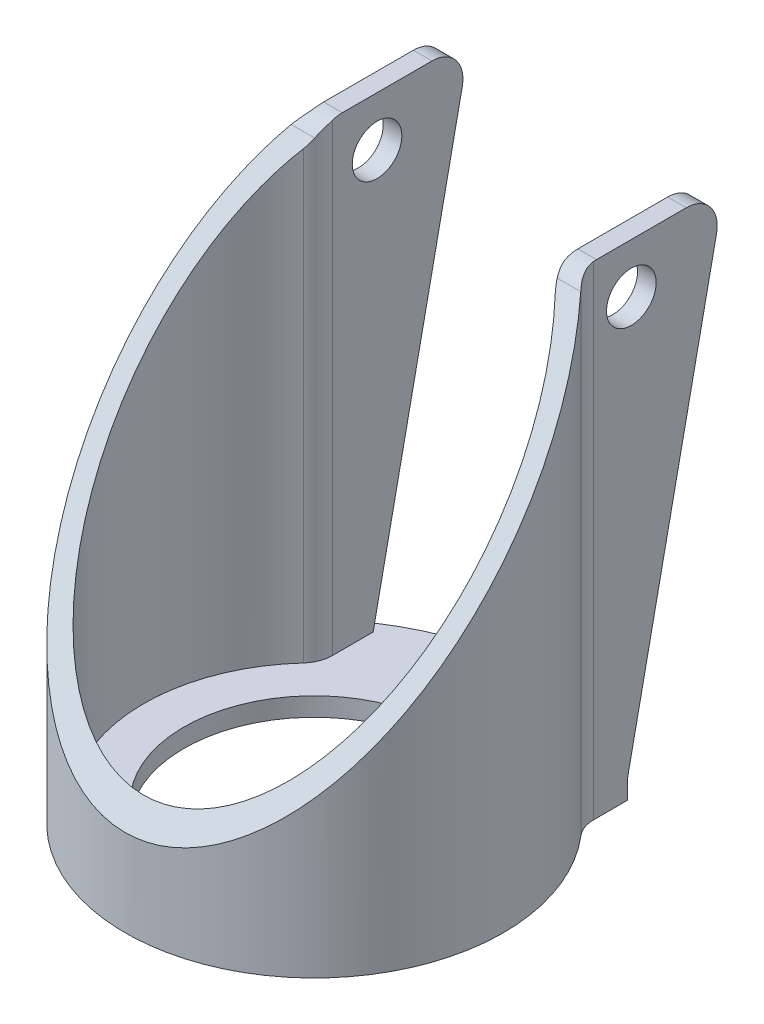
ISO-10303-21;
HEADER;
FILE_DESCRIPTION(('STEP AP214'),'2;1');
FILE_NAME('part.step','',(''),(''),'','','');
FILE_SCHEMA(('AUTOMOTIVE_DESIGN { 1 0 10303 214 1 1 1 1 }'));
ENDSEC;
DATA;
#1=APPLICATION_CONTEXT('core data for automotive mechanical design processes');
#2=APPLICATION_PROTOCOL_DEFINITION('international standard','automotive_design',2000,#1);
#3=PRODUCT_CONTEXT('',#1,'mechanical');
#4=PRODUCT('Part','Part','',(#3));
#5=PRODUCT_RELATED_PRODUCT_CATEGORY('part','',(#4));
#6=PRODUCT_DEFINITION_FORMATION('','',#4);
#7=PRODUCT_DEFINITION_CONTEXT('part definition',#1,'design');
#8=PRODUCT_DEFINITION('design','',#6,#7);
#9=PRODUCT_DEFINITION_SHAPE('','',#8);
#10=(LENGTH_UNIT() NAMED_UNIT(*) SI_UNIT(.MILLI.,.METRE.));
#11=(NAMED_UNIT(*) PLANE_ANGLE_UNIT() SI_UNIT($,.RADIAN.));
#12=(NAMED_UNIT(*) SI_UNIT($,.STERADIAN.) SOLID_ANGLE_UNIT());
#13=UNCERTAINTY_MEASURE_WITH_UNIT(LENGTH_MEASURE(1.E-05),#10,'distance_accuracy_value','');
#14=(GEOMETRIC_REPRESENTATION_CONTEXT(3) GLOBAL_UNCERTAINTY_ASSIGNED_CONTEXT((#13)) GLOBAL_UNIT_ASSIGNED_CONTEXT((#10,
#11,#12)) REPRESENTATION_CONTEXT('',''));
#15=CARTESIAN_POINT('',(0.,0.,0.));
#16=DIRECTION('',(0.,0.,1.));
#17=DIRECTION('',(1.,0.,0.));
#18=AXIS2_PLACEMENT_3D('',#15,#16,#17);
#19=CARTESIAN_POINT('',(0.,78.,0.));
#20=DIRECTION('',(0.,-1.,0.));
#21=DIRECTION('',(0.,0.,-1.));
#22=AXIS2_PLACEMENT_3D('',#19,#20,#21);
#23=PLANE('',#22);
#24=DIRECTION('',(0.,0.,1.));
#25=VECTOR('',#24,1.);
#26=CARTESIAN_POINT('',(-22.,78.,-21.1246301742776));
#27=LINE('',#26,#25);
#28=CARTESIAN_POINT('',(-22.,78.,-37.975286677213));
#29=VERTEX_POINT('',#28);
#30=CARTESIAN_POINT('',(-22.,78.,-23.5153561893177));
#31=VERTEX_POINT('',#30);
#32=EDGE_CURVE('E406',#29,#31,#27,.T.);
#33=ORIENTED_EDGE('',*,*,#32,.T.);
#34=DIRECTION('',(1.,0.,0.));
#35=VECTOR('',#34,1.);
#36=CARTESIAN_POINT('',(0.,78.,-23.5153561893177));
#37=LINE('',#36,#35);
#38=CARTESIAN_POINT('',(-19.,78.,-23.5153561893177));
#39=VERTEX_POINT('',#38);
#40=EDGE_CURVE('E441',#31,#39,#37,.T.);
#41=ORIENTED_EDGE('',*,*,#40,.T.);
#42=DIRECTION('',(0.,0.,-1.));
#43=VECTOR('',#42,1.);
#44=CARTESIAN_POINT('',(-19.,78.,-44.1246301742776));
#45=LINE('',#44,#43);
#46=CARTESIAN_POINT('',(-19.,78.,-37.975286677213));
#47=VERTEX_POINT('',#46);
#48=EDGE_CURVE('E367',#39,#47,#45,.T.);
#49=ORIENTED_EDGE('',*,*,#48,.T.);
#50=DIRECTION('',(-1.,0.,0.));
#51=VECTOR('',#50,1.);
#52=CARTESIAN_POINT('',(0.,78.,-37.975286677213));
#53=LINE('',#52,#51);
#54=EDGE_CURVE('E489',#47,#29,#53,.T.);
#55=ORIENTED_EDGE('',*,*,#54,.T.);
#56=EDGE_LOOP('',(#33,#41,#49,#55));
#57=FACE_BOUND('',#56,.T.);
#58=ADVANCED_FACE('F54',(#57),#23,.F.);
#59=CARTESIAN_POINT('',(0.,3.,0.));
#60=DIRECTION('',(0.,1.,0.));
#61=DIRECTION('',(0.,0.,1.));
#62=AXIS2_PLACEMENT_3D('',#59,#60,#61);
#63=PLANE('',#62);
#64=CARTESIAN_POINT('',(0.,3.,0.));
#65=DIRECTION('',(0.,1.,0.));
#66=DIRECTION('',(0.,0.,1.));
#67=AXIS2_PLACEMENT_3D('',#64,#65,#66);
#68=CIRCLE('',#67,21.);
#69=CARTESIAN_POINT('',(0.,3.,21.));
#70=VERTEX_POINT('',#69);
#71=EDGE_CURVE('E400',#70,#70,#68,.T.);
#72=ORIENTED_EDGE('',*,*,#71,.F.);
#73=EDGE_LOOP('',(#72));
#74=FACE_BOUND('',#73,.T.);
#75=CARTESIAN_POINT('',(0.,3.,0.));
#76=DIRECTION('',(0.,1.,0.));
#77=DIRECTION('',(0.,0.,1.));
#78=AXIS2_PLACEMENT_3D('',#75,#76,#77);
#79=CIRCLE('',#78,36.);
#80=CARTESIAN_POINT('',(22.,3.,-28.49561369755));
#81=VERTEX_POINT('',#80);
#82=CARTESIAN_POINT('',(-22.,3.,-28.49561369755));
#83=VERTEX_POINT('',#82);
#84=EDGE_CURVE('E502',#81,#83,#79,.T.);
#85=ORIENTED_EDGE('',*,*,#84,.T.);
#86=DIRECTION('',(-1.,0.,0.));
#87=VECTOR('',#86,1.);
#88=CARTESIAN_POINT('',(-22.,3.,-28.49561369755));
#89=LINE('',#88,#87);
#90=CARTESIAN_POINT('',(-19.,3.,-28.49561369755));
#91=VERTEX_POINT('',#90);
#92=EDGE_CURVE('E227',#91,#83,#89,.T.);
#93=ORIENTED_EDGE('',*,*,#92,.F.);
#94=DIRECTION('',(0.,0.,-1.));
#95=VECTOR('',#94,1.);
#96=CARTESIAN_POINT('',(-19.,3.,-19.880895352071));
#97=LINE('',#96,#95);
#98=CARTESIAN_POINT('',(-19.,3.,-21.9146070008111));
#99=VERTEX_POINT('',#98);
#100=EDGE_CURVE('E218',#99,#91,#97,.T.);
#101=ORIENTED_EDGE('',*,*,#100,.F.);
#102=CARTESIAN_POINT('',(-24.,3.,-21.9146070008111));
#103=DIRECTION('',(0.,1.,0.));
#104=DIRECTION('',(0.,0.,1.));
#105=AXIS2_PLACEMENT_3D('',#102,#103,#104);
#106=CIRCLE('',#105,5.);
#107=CARTESIAN_POINT('',(-20.3076923076923,3.,-18.5431290006863));
#108=VERTEX_POINT('',#107);
#109=EDGE_CURVE('E251',#99,#108,#106,.F.);
#110=ORIENTED_EDGE('',*,*,#109,.T.);
#111=CARTESIAN_POINT('',(0.,3.,0.));
#112=DIRECTION('',(0.,-1.,0.));
#113=DIRECTION('',(0.,0.,-1.));
#114=AXIS2_PLACEMENT_3D('',#111,#112,#113);
#115=CIRCLE('',#114,27.5);
#116=CARTESIAN_POINT('',(20.3076923076923,3.,-18.5431290006863));
#117=VERTEX_POINT('',#116);
#118=EDGE_CURVE('E215',#117,#108,#115,.T.);
#119=ORIENTED_EDGE('',*,*,#118,.F.);
#120=CARTESIAN_POINT('',(24.,3.,-21.9146070008111));
#121=DIRECTION('',(0.,1.,0.));
#122=DIRECTION('',(0.,0.,1.));
#123=AXIS2_PLACEMENT_3D('',#120,#121,#122);
#124=CIRCLE('',#123,5.);
#125=CARTESIAN_POINT('',(19.,3.,-21.9146070008111));
#126=VERTEX_POINT('',#125);
#127=EDGE_CURVE('E214',#117,#126,#124,.F.);
#128=ORIENTED_EDGE('',*,*,#127,.T.);
#129=DIRECTION('',(0.,0.,1.));
#130=VECTOR('',#129,1.);
#131=CARTESIAN_POINT('',(19.,3.,-19.880895352071));
#132=LINE('',#131,#130);
#133=CARTESIAN_POINT('',(19.,3.,-28.49561369755));
#134=VERTEX_POINT('',#133);
#135=EDGE_CURVE('E200',#134,#126,#132,.T.);
#136=ORIENTED_EDGE('',*,*,#135,.F.);
#137=DIRECTION('',(-1.,0.,0.));
#138=VECTOR('',#137,1.);
#139=CARTESIAN_POINT('',(22.,3.,-28.49561369755));
#140=LINE('',#139,#138);
#141=EDGE_CURVE('E188',#81,#134,#140,.T.);
#142=ORIENTED_EDGE('',*,*,#141,.F.);
#143=EDGE_LOOP('',(#85,#93,#101,#110,#119,#128,#136,#142));
#144=FACE_BOUND('',#143,.T.);
#145=ADVANCED_FACE('F211',(#74,#144),#63,.T.);
#146=CARTESIAN_POINT('',(0.,3.,0.));
#147=DIRECTION('',(0.,-1.,0.));
#148=DIRECTION('',(0.,0.,-1.));
#149=AXIS2_PLACEMENT_3D('',#146,#147,#148);
#150=CYLINDRICAL_SURFACE('',#149,30.5);
#151=CARTESIAN_POINT('',(0.,0.,0.));
#152=DIRECTION('',(0.,1.,0.));
#153=DIRECTION('',(0.,0.,1.));
#154=AXIS2_PLACEMENT_3D('',#151,#152,#153);
#155=CIRCLE('',#154,30.5);
#156=CARTESIAN_POINT('',(-23.1971830985916,0.,-19.8025426723544));
#157=VERTEX_POINT('',#156);
#158=CARTESIAN_POINT('',(23.1971830985915,0.,-19.8025426723544));
#159=VERTEX_POINT('',#158);
#160=EDGE_CURVE('E199',#157,#159,#155,.T.);
#161=ORIENTED_EDGE('',*,*,#160,.T.);
#162=DIRECTION('',(0.,-1.,0.));
#163=VECTOR('',#162,1.);
#164=CARTESIAN_POINT('',(23.1971830985915,3.,-19.8025426723544));
#165=LINE('',#164,#163);
#166=CARTESIAN_POINT('',(23.1971830985915,76.3488827671711,-19.8025426723544));
#167=VERTEX_POINT('',#166);
#168=EDGE_CURVE('E246',#159,#167,#165,.F.);
#169=ORIENTED_EDGE('',*,*,#168,.T.);
#170=CARTESIAN_POINT('',(22.,77.3914040033924,-21.1246301742776));
#171=CARTESIAN_POINT('',(22.1289321810784,77.3183150493568,-20.9903877406979));
#172=CARTESIAN_POINT('',(22.2546545072071,77.2376963424579,-20.8569621551417));
#173=CARTESIAN_POINT('',(22.4973369160986,77.0615056867437,-20.5949289066458));
#174=CARTESIAN_POINT('',(22.614367908363,76.9660805305629,-20.4662878701357));
#175=CARTESIAN_POINT('',(22.839823941531,76.7590012604669,-20.2143763734541));
#176=CARTESIAN_POINT('',(22.948245538373,76.6473407018836,-20.0911080713725));
#177=CARTESIAN_POINT('',(23.1560241114799,76.4064533393783,-19.8513045827247));
#178=CARTESIAN_POINT('',(23.2552858808033,76.2770706952375,-19.7348439213353));
#179=CARTESIAN_POINT('',(23.3487210351135,76.1391943188989,-19.6236394693861));
#180=B_SPLINE_CURVE_WITH_KNOTS('',3,(#170,#171,#172,#173,#174,#175,#176,#177,#178,#179),
.UNSPECIFIED.,.F.,.F.,(4,2,2,2,4),(0.,0.599925544756917,1.19424426644912,1.7887995512264,
2.38896610469934),.UNSPECIFIED.);
#181=CARTESIAN_POINT('',(23.3487210351134,76.1391943188987,-19.6236394693862));
#182=VERTEX_POINT('',#181);
#183=EDGE_CURVE('E275',#167,#182,#180,.T.);
#184=ORIENTED_EDGE('',*,*,#183,.T.);
#185=CARTESIAN_POINT('',(0.,51.8114088839052,0.));
#186=DIRECTION('',(0.,-0.627838863779736,-0.778343343986297));
#187=DIRECTION('',(0.,-0.778343343986297,0.627838863779736));
#188=AXIS2_PLACEMENT_3D('',#185,#186,#187);
#189=ELLIPSE('',#188,48.5793437768139,30.5);
#190=CARTESIAN_POINT('',(-23.3487210351134,76.1391943188987,-19.6236394693862));
#191=VERTEX_POINT('',#190);
#192=EDGE_CURVE('E555',#182,#191,#189,.T.);
#193=ORIENTED_EDGE('',*,*,#192,.T.);
#194=CARTESIAN_POINT('',(-23.3487210351134,76.1391943188987,-19.6236394693862));
#195=CARTESIAN_POINT('',(-23.2552858808033,76.2770706952374,-19.7348439213353));
#196=CARTESIAN_POINT('',(-23.15602411148,76.4064533393782,-19.8513045827247));
#197=CARTESIAN_POINT('',(-22.948245538373,76.6473407018835,-20.0911080713725));
#198=CARTESIAN_POINT('',(-22.8398239415311,76.7590012604669,-20.2143763734541));
#199=CARTESIAN_POINT('',(-22.6143679083631,76.9660805305629,-20.4662878701357));
#200=CARTESIAN_POINT('',(-22.4973369160986,77.0615056867437,-20.5949289066458));
#201=CARTESIAN_POINT('',(-22.2546545072072,77.2376963424579,-20.8569621551417));
#202=CARTESIAN_POINT('',(-22.1289321810784,77.3183150493568,-20.9903877406979));
#203=CARTESIAN_POINT('',(-22.,77.3914040033924,-21.1246301742776));
#204=B_SPLINE_CURVE_WITH_KNOTS('',3,(#194,#195,#196,#197,#198,#199,#200,#201,#202,#203),
.UNSPECIFIED.,.F.,.F.,(4,2,2,2,4),(0.,0.600166553472969,1.19472183825027,1.78904055994249,
2.38896610469943),.UNSPECIFIED.);
#205=CARTESIAN_POINT('',(-23.1971830985916,76.348882767171,-19.8025426723544));
#206=VERTEX_POINT('',#205);
#207=EDGE_CURVE('E282',#191,#206,#204,.T.);
#208=ORIENTED_EDGE('',*,*,#207,.T.);
#209=DIRECTION('',(0.,-1.,0.));
#210=VECTOR('',#209,1.);
#211=CARTESIAN_POINT('',(-23.1971830985916,3.,-19.8025426723544));
#212=LINE('',#211,#210);
#213=EDGE_CURVE('E243',#206,#157,#212,.T.);
#214=ORIENTED_EDGE('',*,*,#213,.T.);
#215=EDGE_LOOP('',(#161,#169,#184,#193,#208,#214));
#216=FACE_BOUND('',#215,.T.);
#217=ADVANCED_FACE('F289',(#216),#150,.T.);
#218=CARTESIAN_POINT('',(22.,3.,0.));
#219=DIRECTION('',(1.,0.,0.));
#220=DIRECTION('',(0.,0.,-1.));
#221=AXIS2_PLACEMENT_3D('',#218,#219,#220);
#222=PLANE('',#221);
#223=CARTESIAN_POINT('',(22.,70.,-29.1246301742776));
#224=DIRECTION('',(1.,0.,0.));
#225=DIRECTION('',(0.,0.,-1.));
#226=AXIS2_PLACEMENT_3D('',#223,#224,#225);
#227=CIRCLE('',#226,4.);
#228=CARTESIAN_POINT('',(22.,70.,-33.1246301742776));
#229=VERTEX_POINT('',#228);
#230=EDGE_CURVE('E556',#229,#229,#227,.T.);
#231=ORIENTED_EDGE('',*,*,#230,.F.);
#232=EDGE_LOOP('',(#231));
#233=FACE_BOUND('',#232,.T.);
#234=CARTESIAN_POINT('',(22.,73.,-23.5153561893177));
#235=DIRECTION('',(1.,0.,0.));
#236=DIRECTION('',(0.,0.,-1.));
#237=AXIS2_PLACEMENT_3D('',#234,#235,#236);
#238=CIRCLE('',#237,5.);
#239=CARTESIAN_POINT('',(22.,78.,-23.5153561893177));
#240=VERTEX_POINT('',#239);
#241=CARTESIAN_POINT('',(22.,77.9781906725213,-23.0488611432322));
#242=VERTEX_POINT('',#241);
#243=EDGE_CURVE('E353',#240,#242,#238,.T.);
#244=ORIENTED_EDGE('',*,*,#243,.T.);
#245=DIRECTION('',(0.,-1.,0.));
#246=VECTOR('',#245,1.);
#247=CARTESIAN_POINT('',(22.,3.,-23.0488611432322));
#248=LINE('',#247,#246);
#249=CARTESIAN_POINT('',(22.,0.,-23.0488611432322));
#250=VERTEX_POINT('',#249);
#251=EDGE_CURVE('E240',#242,#250,#248,.T.);
#252=ORIENTED_EDGE('',*,*,#251,.T.);
#253=DIRECTION('',(0.,0.,1.));
#254=VECTOR('',#253,1.);
#255=CARTESIAN_POINT('',(22.,0.,0.));
#256=LINE('',#255,#254);
#257=CARTESIAN_POINT('',(22.,0.,-28.49561369755));
#258=VERTEX_POINT('',#257);
#259=EDGE_CURVE('E517',#258,#250,#256,.T.);
#260=ORIENTED_EDGE('',*,*,#259,.F.);
#261=DIRECTION('',(0.,-1.,0.));
#262=VECTOR('',#261,1.);
#263=CARTESIAN_POINT('',(22.,3.,-28.49561369755));
#264=LINE('',#263,#262);
#265=EDGE_CURVE('E496',#81,#258,#264,.T.);
#266=ORIENTED_EDGE('',*,*,#265,.F.);
#267=DIRECTION('',(0.,0.978969950534633,-0.20400449982836));
#268=VECTOR('',#267,1.);
#269=CARTESIAN_POINT('',(22.,3.,-28.49561369755));
#270=LINE('',#269,#268);
#271=CARTESIAN_POINT('',(22.,71.9799775008582,-42.8701364298862));
#272=VERTEX_POINT('',#271);
#273=EDGE_CURVE('E194',#81,#272,#270,.T.);
#274=ORIENTED_EDGE('',*,*,#273,.T.);
#275=CARTESIAN_POINT('',(22.,73.,-37.975286677213));
#276=DIRECTION('',(1.,0.,0.));
#277=DIRECTION('',(0.,0.,-1.));
#278=AXIS2_PLACEMENT_3D('',#275,#276,#277);
#279=CIRCLE('',#278,5.);
#280=CARTESIAN_POINT('',(22.,78.,-37.975286677213));
#281=VERTEX_POINT('',#280);
#282=EDGE_CURVE('E529',#272,#281,#279,.T.);
#283=ORIENTED_EDGE('',*,*,#282,.T.);
#284=DIRECTION('',(0.,0.,-1.));
#285=VECTOR('',#284,1.);
#286=CARTESIAN_POINT('',(22.,78.,-21.1246301742776));
#287=LINE('',#286,#285);
#288=EDGE_CURVE('E346',#240,#281,#287,.T.);
#289=ORIENTED_EDGE('',*,*,#288,.F.);
#290=EDGE_LOOP('',(#244,#252,#260,#266,#274,#283,#289));
#291=FACE_BOUND('',#290,.T.);
#292=ADVANCED_FACE('F294',(#233,#291),#222,.T.);
#293=CARTESIAN_POINT('',(0.,3.,0.));
#294=DIRECTION('',(0.,-1.,0.));
#295=DIRECTION('',(0.,0.,-1.));
#296=AXIS2_PLACEMENT_3D('',#293,#294,#295);
#297=CYLINDRICAL_SURFACE('',#296,36.);
#298=CARTESIAN_POINT('',(0.,0.,0.));
#299=DIRECTION('',(0.,1.,0.));
#300=DIRECTION('',(0.,0.,1.));
#301=AXIS2_PLACEMENT_3D('',#298,#299,#300);
#302=CIRCLE('',#301,36.);
#303=CARTESIAN_POINT('',(-22.,0.,-28.49561369755));
#304=VERTEX_POINT('',#303);
#305=EDGE_CURVE('E515',#258,#304,#302,.T.);
#306=ORIENTED_EDGE('',*,*,#305,.T.);
#307=DIRECTION('',(0.,-1.,0.));
#308=VECTOR('',#307,1.);
#309=CARTESIAN_POINT('',(-22.,3.,-28.49561369755));
#310=LINE('',#309,#308);
#311=EDGE_CURVE('E497',#83,#304,#310,.T.);
#312=ORIENTED_EDGE('',*,*,#311,.F.);
#313=ORIENTED_EDGE('',*,*,#84,.F.);
#314=ORIENTED_EDGE('',*,*,#265,.T.);
#315=EDGE_LOOP('',(#306,#312,#313,#314));
#316=FACE_BOUND('',#315,.T.);
#317=ADVANCED_FACE('F583',(#316),#297,.T.);
#318=CARTESIAN_POINT('',(-22.,3.,0.));
#319=DIRECTION('',(1.,0.,0.));
#320=DIRECTION('',(0.,0.,-1.));
#321=AXIS2_PLACEMENT_3D('',#318,#319,#320);
#322=PLANE('',#321);
#323=CARTESIAN_POINT('',(-22.,70.,-29.1246301742776));
#324=DIRECTION('',(-1.,0.,0.));
#325=DIRECTION('',(0.,0.,1.));
#326=AXIS2_PLACEMENT_3D('',#323,#324,#325);
#327=CIRCLE('',#326,4.);
#328=CARTESIAN_POINT('',(-22.,70.,-25.1246301742776));
#329=VERTEX_POINT('',#328);
#330=EDGE_CURVE('E396',#329,#329,#327,.T.);
#331=ORIENTED_EDGE('',*,*,#330,.F.);
#332=EDGE_LOOP('',(#331));
#333=FACE_BOUND('',#332,.T.);
#334=DIRECTION('',(0.,0.,1.));
#335=VECTOR('',#334,1.);
#336=CARTESIAN_POINT('',(-22.,0.,0.));
#337=LINE('',#336,#335);
#338=CARTESIAN_POINT('',(-22.,0.,-23.0488611432322));
#339=VERTEX_POINT('',#338);
#340=EDGE_CURVE('E506',#304,#339,#337,.T.);
#341=ORIENTED_EDGE('',*,*,#340,.T.);
#342=DIRECTION('',(0.,1.,0.));
#343=VECTOR('',#342,1.);
#344=CARTESIAN_POINT('',(-22.,77.3914040033924,-23.0488611432322));
#345=LINE('',#344,#343);
#346=CARTESIAN_POINT('',(-22.,77.9781906725213,-23.0488611432322));
#347=VERTEX_POINT('',#346);
#348=EDGE_CURVE('E248',#339,#347,#345,.T.);
#349=ORIENTED_EDGE('',*,*,#348,.T.);
#350=CARTESIAN_POINT('',(-22.,73.,-23.5153561893177));
#351=DIRECTION('',(1.,0.,0.));
#352=DIRECTION('',(0.,0.,-1.));
#353=AXIS2_PLACEMENT_3D('',#350,#351,#352);
#354=CIRCLE('',#353,5.);
#355=EDGE_CURVE('E354',#347,#31,#354,.F.);
#356=ORIENTED_EDGE('',*,*,#355,.T.);
#357=ORIENTED_EDGE('',*,*,#32,.F.);
#358=CARTESIAN_POINT('',(-22.,73.,-37.975286677213));
#359=DIRECTION('',(1.,0.,0.));
#360=DIRECTION('',(0.,0.,-1.));
#361=AXIS2_PLACEMENT_3D('',#358,#359,#360);
#362=CIRCLE('',#361,5.);
#363=CARTESIAN_POINT('',(-22.,71.9799775008582,-42.8701364298862));
#364=VERTEX_POINT('',#363);
#365=EDGE_CURVE('E485',#29,#364,#362,.F.);
#366=ORIENTED_EDGE('',*,*,#365,.T.);
#367=DIRECTION('',(0.,0.978969950534633,-0.20400449982836));
#368=VECTOR('',#367,1.);
#369=CARTESIAN_POINT('',(-22.,3.,-28.49561369755));
#370=LINE('',#369,#368);
#371=EDGE_CURVE('E345',#83,#364,#370,.T.);
#372=ORIENTED_EDGE('',*,*,#371,.F.);
#373=ORIENTED_EDGE('',*,*,#311,.T.);
#374=EDGE_LOOP('',(#341,#349,#356,#357,#366,#372,#373));
#375=FACE_BOUND('',#374,.T.);
#376=ADVANCED_FACE('F331',(#333,#375),#322,.F.);
#377=CARTESIAN_POINT('',(0.,0.,0.));
#378=DIRECTION('',(0.,1.,0.));
#379=DIRECTION('',(0.,0.,1.));
#380=AXIS2_PLACEMENT_3D('',#377,#378,#379);
#381=PLANE('',#380);
#382=CARTESIAN_POINT('',(0.,0.,0.));
#383=DIRECTION('',(0.,1.,0.));
#384=DIRECTION('',(0.,0.,1.));
#385=AXIS2_PLACEMENT_3D('',#382,#383,#384);
#386=CIRCLE('',#385,21.);
#387=CARTESIAN_POINT('',(0.,0.,21.));
#388=VERTEX_POINT('',#387);
#389=EDGE_CURVE('E397',#388,#388,#386,.T.);
#390=ORIENTED_EDGE('',*,*,#389,.T.);
#391=EDGE_LOOP('',(#390));
#392=FACE_BOUND('',#391,.T.);
#393=ORIENTED_EDGE('',*,*,#160,.F.);
#394=CARTESIAN_POINT('',(-27.,0.,-23.0488611432322));
#395=DIRECTION('',(0.,1.,0.));
#396=DIRECTION('',(0.,0.,1.));
#397=AXIS2_PLACEMENT_3D('',#394,#395,#396);
#398=CIRCLE('',#397,5.);
#399=EDGE_CURVE('E67',#157,#339,#398,.T.);
#400=ORIENTED_EDGE('',*,*,#399,.T.);
#401=ORIENTED_EDGE('',*,*,#340,.F.);
#402=ORIENTED_EDGE('',*,*,#305,.F.);
#403=ORIENTED_EDGE('',*,*,#259,.T.);
#404=CARTESIAN_POINT('',(27.,0.,-23.0488611432322));
#405=DIRECTION('',(0.,1.,0.));
#406=DIRECTION('',(0.,0.,1.));
#407=AXIS2_PLACEMENT_3D('',#404,#405,#406);
#408=CIRCLE('',#407,5.);
#409=EDGE_CURVE('E79',#250,#159,#408,.T.);
#410=ORIENTED_EDGE('',*,*,#409,.T.);
#411=EDGE_LOOP('',(#393,#400,#401,#402,#403,#410));
#412=FACE_BOUND('',#411,.T.);
#413=ADVANCED_FACE('F324',(#392,#412),#381,.F.);
#414=DIRECTION('',(0.,0.,1.));
#415=VECTOR('',#414,1.);
#416=CARTESIAN_POINT('',(19.,78.,-44.1246301742776));
#417=LINE('',#416,#415);
#418=CARTESIAN_POINT('',(19.,78.,-37.975286677213));
#419=VERTEX_POINT('',#418);
#420=CARTESIAN_POINT('',(19.,78.,-23.5153561893177));
#421=VERTEX_POINT('',#420);
#422=EDGE_CURVE('E337',#419,#421,#417,.T.);
#423=ORIENTED_EDGE('',*,*,#422,.T.);
#424=DIRECTION('',(1.,0.,0.));
#425=VECTOR('',#424,1.);
#426=CARTESIAN_POINT('',(0.,78.,-23.5153561893177));
#427=LINE('',#426,#425);
#428=EDGE_CURVE('E340',#421,#240,#427,.T.);
#429=ORIENTED_EDGE('',*,*,#428,.T.);
#430=ORIENTED_EDGE('',*,*,#288,.T.);
#431=DIRECTION('',(-1.,0.,0.));
#432=VECTOR('',#431,1.);
#433=CARTESIAN_POINT('',(0.,78.,-37.975286677213));
#434=LINE('',#433,#432);
#435=EDGE_CURVE('E343',#281,#419,#434,.T.);
#436=ORIENTED_EDGE('',*,*,#435,.T.);
#437=EDGE_LOOP('',(#423,#429,#430,#436));
#438=FACE_BOUND('',#437,.T.);
#439=ADVANCED_FACE('F314',(#438),#23,.F.);
#440=CARTESIAN_POINT('',(0.,-5.56612732545078,-26.7105450960671));
#441=DIRECTION('',(0.,0.20400449982836,0.978969950534633));
#442=DIRECTION('',(0.,-0.978969950534633,0.20400449982836));
#443=AXIS2_PLACEMENT_3D('',#440,#441,#442);
#444=PLANE('',#443);
#445=DIRECTION('',(0.,0.978969950534633,-0.20400449982836));
#446=VECTOR('',#445,1.);
#447=CARTESIAN_POINT('',(19.,3.,-28.49561369755));
#448=LINE('',#447,#446);
#449=CARTESIAN_POINT('',(19.,71.9799775008582,-42.8701364298862));
#450=VERTEX_POINT('',#449);
#451=EDGE_CURVE('E191',#134,#450,#448,.T.);
#452=ORIENTED_EDGE('',*,*,#451,.T.);
#453=DIRECTION('',(-1.,0.,0.));
#454=VECTOR('',#453,1.);
#455=CARTESIAN_POINT('',(0.,71.9799775008582,-42.8701364298862));
#456=LINE('',#455,#454);
#457=EDGE_CURVE('E575',#450,#272,#456,.F.);
#458=ORIENTED_EDGE('',*,*,#457,.T.);
#459=ORIENTED_EDGE('',*,*,#273,.F.);
#460=ORIENTED_EDGE('',*,*,#141,.T.);
#461=EDGE_LOOP('',(#452,#458,#459,#460));
#462=FACE_BOUND('',#461,.T.);
#463=ADVANCED_FACE('F190',(#462),#444,.F.);
#464=CARTESIAN_POINT('',(19.,0.,0.));
#465=DIRECTION('',(1.,0.,0.));
#466=DIRECTION('',(0.,0.,-1.));
#467=AXIS2_PLACEMENT_3D('',#464,#465,#466);
#468=PLANE('',#467);
#469=CARTESIAN_POINT('',(19.,70.,-29.1246301742776));
#470=DIRECTION('',(1.,0.,0.));
#471=DIRECTION('',(0.,0.,-1.));
#472=AXIS2_PLACEMENT_3D('',#469,#470,#471);
#473=CIRCLE('',#472,4.);
#474=CARTESIAN_POINT('',(19.,70.,-33.1246301742776));
#475=VERTEX_POINT('',#474);
#476=EDGE_CURVE('E395',#475,#475,#473,.T.);
#477=ORIENTED_EDGE('',*,*,#476,.T.);
#478=EDGE_LOOP('',(#477));
#479=FACE_BOUND('',#478,.T.);
#480=ORIENTED_EDGE('',*,*,#135,.T.);
#481=DIRECTION('',(0.,-1.,0.));
#482=VECTOR('',#481,1.);
#483=CARTESIAN_POINT('',(19.,0.,-21.9146070008111));
#484=LINE('',#483,#482);
#485=CARTESIAN_POINT('',(19.,77.7368346008168,-21.9146070008111));
#486=VERTEX_POINT('',#485);
#487=EDGE_CURVE('E372',#126,#486,#484,.F.);
#488=ORIENTED_EDGE('',*,*,#487,.T.);
#489=CARTESIAN_POINT('',(19.,73.,-23.5153561893177));
#490=DIRECTION('',(1.,0.,0.));
#491=DIRECTION('',(0.,0.,-1.));
#492=AXIS2_PLACEMENT_3D('',#489,#490,#491);
#493=CIRCLE('',#492,5.);
#494=EDGE_CURVE('E351',#486,#421,#493,.F.);
#495=ORIENTED_EDGE('',*,*,#494,.T.);
#496=ORIENTED_EDGE('',*,*,#422,.F.);
#497=CARTESIAN_POINT('',(19.,73.,-37.975286677213));
#498=DIRECTION('',(1.,0.,0.));
#499=DIRECTION('',(0.,0.,-1.));
#500=AXIS2_PLACEMENT_3D('',#497,#498,#499);
#501=CIRCLE('',#500,5.);
#502=EDGE_CURVE('E208',#419,#450,#501,.F.);
#503=ORIENTED_EDGE('',*,*,#502,.T.);
#504=ORIENTED_EDGE('',*,*,#451,.F.);
#505=EDGE_LOOP('',(#480,#488,#495,#496,#503,#504));
#506=FACE_BOUND('',#505,.T.);
#507=ADVANCED_FACE('F204',(#479,#506),#468,.F.);
#508=CARTESIAN_POINT('',(0.,3.,0.));
#509=DIRECTION('',(0.,-1.,0.));
#510=DIRECTION('',(0.,0.,-1.));
#511=AXIS2_PLACEMENT_3D('',#508,#509,#510);
#512=CYLINDRICAL_SURFACE('',#511,27.5);
#513=CARTESIAN_POINT('',(0.,51.8114088839052,0.));
#514=DIRECTION('',(0.,-0.627838863779736,-0.778343343986297));
#515=DIRECTION('',(0.,-0.778343343986297,0.627838863779736));
#516=AXIS2_PLACEMENT_3D('',#513,#514,#515);
#517=ELLIPSE('',#516,43.8010476676191,27.5);
#518=CARTESIAN_POINT('',(-20.3076923076923,74.7996656915102,-18.5431290006863));
#519=VERTEX_POINT('',#518);
#520=CARTESIAN_POINT('',(20.3076923076923,74.7996656915102,-18.5431290006863));
#521=VERTEX_POINT('',#520);
#522=EDGE_CURVE('E549',#519,#521,#517,.F.);
#523=ORIENTED_EDGE('',*,*,#522,.T.);
#524=DIRECTION('',(0.,-1.,0.));
#525=VECTOR('',#524,1.);
#526=CARTESIAN_POINT('',(20.3076923076923,3.,-18.5431290006863));
#527=LINE('',#526,#525);
#528=EDGE_CURVE('E542',#521,#117,#527,.T.);
#529=ORIENTED_EDGE('',*,*,#528,.T.);
#530=ORIENTED_EDGE('',*,*,#118,.T.);
#531=DIRECTION('',(0.,-1.,0.));
#532=VECTOR('',#531,1.);
#533=CARTESIAN_POINT('',(-20.3076923076923,3.,-18.5431290006863));
#534=LINE('',#533,#532);
#535=EDGE_CURVE('E383',#108,#519,#534,.F.);
#536=ORIENTED_EDGE('',*,*,#535,.T.);
#537=EDGE_LOOP('',(#523,#529,#530,#536));
#538=FACE_BOUND('',#537,.T.);
#539=ADVANCED_FACE('F462',(#538),#512,.F.);
#540=CARTESIAN_POINT('',(-19.,0.,0.));
#541=DIRECTION('',(-1.,0.,0.));
#542=DIRECTION('',(0.,0.,1.));
#543=AXIS2_PLACEMENT_3D('',#540,#541,#542);
#544=PLANE('',#543);
#545=CARTESIAN_POINT('',(-19.,70.,-29.1246301742776));
#546=DIRECTION('',(-1.,0.,0.));
#547=DIRECTION('',(0.,0.,1.));
#548=AXIS2_PLACEMENT_3D('',#545,#546,#547);
#549=CIRCLE('',#548,4.);
#550=CARTESIAN_POINT('',(-19.,70.,-25.1246301742776));
#551=VERTEX_POINT('',#550);
#552=EDGE_CURVE('E392',#551,#551,#549,.T.);
#553=ORIENTED_EDGE('',*,*,#552,.T.);
#554=EDGE_LOOP('',(#553));
#555=FACE_BOUND('',#554,.T.);
#556=CARTESIAN_POINT('',(-19.,73.,-23.5153561893177));
#557=DIRECTION('',(-1.,0.,0.));
#558=DIRECTION('',(0.,0.,1.));
#559=AXIS2_PLACEMENT_3D('',#556,#557,#558);
#560=CIRCLE('',#559,5.);
#561=CARTESIAN_POINT('',(-19.,77.7368346008168,-21.9146070008111));
#562=VERTEX_POINT('',#561);
#563=EDGE_CURVE('E571',#39,#562,#560,.F.);
#564=ORIENTED_EDGE('',*,*,#563,.T.);
#565=DIRECTION('',(0.,-1.,0.));
#566=VECTOR('',#565,1.);
#567=CARTESIAN_POINT('',(-19.,0.,-21.9146070008111));
#568=LINE('',#567,#566);
#569=EDGE_CURVE('E238',#562,#99,#568,.T.);
#570=ORIENTED_EDGE('',*,*,#569,.T.);
#571=ORIENTED_EDGE('',*,*,#100,.T.);
#572=DIRECTION('',(0.,0.978969950534633,-0.20400449982836));
#573=VECTOR('',#572,1.);
#574=CARTESIAN_POINT('',(-19.,3.,-28.49561369755));
#575=LINE('',#574,#573);
#576=CARTESIAN_POINT('',(-19.,71.9799775008582,-42.8701364298862));
#577=VERTEX_POINT('',#576);
#578=EDGE_CURVE('E209',#91,#577,#575,.T.);
#579=ORIENTED_EDGE('',*,*,#578,.T.);
#580=CARTESIAN_POINT('',(-19.,73.,-37.975286677213));
#581=DIRECTION('',(-1.,0.,0.));
#582=DIRECTION('',(0.,0.,1.));
#583=AXIS2_PLACEMENT_3D('',#580,#581,#582);
#584=CIRCLE('',#583,5.);
#585=EDGE_CURVE('E486',#577,#47,#584,.F.);
#586=ORIENTED_EDGE('',*,*,#585,.T.);
#587=ORIENTED_EDGE('',*,*,#48,.F.);
#588=EDGE_LOOP('',(#564,#570,#571,#579,#586,#587));
#589=FACE_BOUND('',#588,.T.);
#590=ADVANCED_FACE('F452',(#555,#589),#544,.F.);
#591=CARTESIAN_POINT('',(0.,-5.56612732545078,-26.7105450960671));
#592=DIRECTION('',(0.,0.20400449982836,0.978969950534633));
#593=DIRECTION('',(0.,-0.978969950534633,0.20400449982836));
#594=AXIS2_PLACEMENT_3D('',#591,#592,#593);
#595=PLANE('',#594);
#596=ORIENTED_EDGE('',*,*,#371,.T.);
#597=DIRECTION('',(-1.,0.,0.));
#598=VECTOR('',#597,1.);
#599=CARTESIAN_POINT('',(0.,71.9799775008582,-42.8701364298862));
#600=LINE('',#599,#598);
#601=EDGE_CURVE('E477',#364,#577,#600,.F.);
#602=ORIENTED_EDGE('',*,*,#601,.T.);
#603=ORIENTED_EDGE('',*,*,#578,.F.);
#604=ORIENTED_EDGE('',*,*,#92,.T.);
#605=EDGE_LOOP('',(#596,#602,#603,#604));
#606=FACE_BOUND('',#605,.T.);
#607=ADVANCED_FACE('F461',(#606),#595,.F.);
#608=CARTESIAN_POINT('',(-30.6373353310201,14.,30.5));
#609=DIRECTION('',(0.,-0.627838863779736,-0.778343343986297));
#610=DIRECTION('',(0.,0.778343343986297,-0.627838863779736));
#611=AXIS2_PLACEMENT_3D('',#608,#609,#610);
#612=PLANE('',#611);
#613=DIRECTION('',(1.,0.,0.));
#614=VECTOR('',#613,1.);
#615=CARTESIAN_POINT('',(-30.6373353310201,76.1391943188987,-19.6236394693862));
#616=LINE('',#615,#614);
#617=CARTESIAN_POINT('',(19.5557376573883,76.1391943188987,-19.6236394693862));
#618=VERTEX_POINT('',#617);
#619=EDGE_CURVE('E570',#182,#618,#616,.F.);
#620=ORIENTED_EDGE('',*,*,#619,.T.);
#621=CARTESIAN_POINT('',(24.,78.9793487474384,-21.9146070008111));
#622=DIRECTION('',(0.,-0.627838863779736,-0.778343343986297));
#623=DIRECTION('',(0.,-0.778343343986297,0.627838863779736));
#624=AXIS2_PLACEMENT_3D('',#621,#622,#623);
#625=ELLIPSE('',#624,7.96382684865801,5.);
#626=EDGE_CURVE('E382',#618,#521,#625,.F.);
#627=ORIENTED_EDGE('',*,*,#626,.T.);
#628=ORIENTED_EDGE('',*,*,#522,.F.);
#629=CARTESIAN_POINT('',(-24.,78.9793487474383,-21.9146070008111));
#630=DIRECTION('',(0.,-0.627838863779736,-0.778343343986297));
#631=DIRECTION('',(0.,-0.778343343986297,0.627838863779736));
#632=AXIS2_PLACEMENT_3D('',#629,#630,#631);
#633=ELLIPSE('',#632,7.96382684865801,5.);
#634=CARTESIAN_POINT('',(-19.5557376573883,76.1391943188987,-19.6236394693862));
#635=VERTEX_POINT('',#634);
#636=EDGE_CURVE('E380',#519,#635,#633,.F.);
#637=ORIENTED_EDGE('',*,*,#636,.T.);
#638=DIRECTION('',(1.,0.,0.));
#639=VECTOR('',#638,1.);
#640=CARTESIAN_POINT('',(-30.6373353310201,76.1391943188987,-19.6236394693862));
#641=LINE('',#640,#639);
#642=EDGE_CURVE('E283',#635,#191,#641,.F.);
#643=ORIENTED_EDGE('',*,*,#642,.T.);
#644=ORIENTED_EDGE('',*,*,#192,.F.);
#645=EDGE_LOOP('',(#620,#627,#628,#637,#643,#644));
#646=FACE_BOUND('',#645,.T.);
#647=ADVANCED_FACE('F465',(#646),#612,.F.);
#648=CARTESIAN_POINT('',(30.500025,70.,-29.1246301742776));
#649=DIRECTION('',(-1.,0.,0.));
#650=DIRECTION('',(0.,0.,1.));
#651=AXIS2_PLACEMENT_3D('',#648,#649,#650);
#652=CYLINDRICAL_SURFACE('',#651,4.);
#653=ORIENTED_EDGE('',*,*,#330,.T.);
#654=EDGE_LOOP('',(#653));
#655=FACE_BOUND('',#654,.T.);
#656=ORIENTED_EDGE('',*,*,#552,.F.);
#657=EDGE_LOOP('',(#656));
#658=FACE_BOUND('',#657,.T.);
#659=ADVANCED_FACE('F470',(#655,#658),#652,.F.);
#660=ORIENTED_EDGE('',*,*,#230,.T.);
#661=EDGE_LOOP('',(#660));
#662=FACE_BOUND('',#661,.T.);
#663=ORIENTED_EDGE('',*,*,#476,.F.);
#664=EDGE_LOOP('',(#663));
#665=FACE_BOUND('',#664,.T.);
#666=ADVANCED_FACE('F608',(#662,#665),#652,.F.);
#667=CARTESIAN_POINT('',(0.,-2.49999999998515E-05,0.));
#668=DIRECTION('',(0.,1.,0.));
#669=DIRECTION('',(0.,0.,1.));
#670=AXIS2_PLACEMENT_3D('',#667,#668,#669);
#671=CYLINDRICAL_SURFACE('',#670,21.);
#672=ORIENTED_EDGE('',*,*,#71,.T.);
#673=EDGE_LOOP('',(#672));
#674=FACE_BOUND('',#673,.T.);
#675=ORIENTED_EDGE('',*,*,#389,.F.);
#676=EDGE_LOOP('',(#675));
#677=FACE_BOUND('',#676,.T.);
#678=ADVANCED_FACE('F302',(#674,#677),#671,.F.);
#679=CARTESIAN_POINT('',(0.,73.,-37.975286677213));
#680=DIRECTION('',(-1.,0.,0.));
#681=DIRECTION('',(0.,0.,1.));
#682=AXIS2_PLACEMENT_3D('',#679,#680,#681);
#683=CYLINDRICAL_SURFACE('',#682,5.);
#684=ORIENTED_EDGE('',*,*,#585,.F.);
#685=ORIENTED_EDGE('',*,*,#601,.F.);
#686=ORIENTED_EDGE('',*,*,#365,.F.);
#687=ORIENTED_EDGE('',*,*,#54,.F.);
#688=EDGE_LOOP('',(#684,#685,#686,#687));
#689=FACE_BOUND('',#688,.T.);
#690=ADVANCED_FACE('F298',(#689),#683,.T.);
#691=CARTESIAN_POINT('',(0.,73.,-37.975286677213));
#692=DIRECTION('',(-1.,0.,0.));
#693=DIRECTION('',(0.,0.,1.));
#694=AXIS2_PLACEMENT_3D('',#691,#692,#693);
#695=CYLINDRICAL_SURFACE('',#694,5.);
#696=ORIENTED_EDGE('',*,*,#282,.F.);
#697=ORIENTED_EDGE('',*,*,#457,.F.);
#698=ORIENTED_EDGE('',*,*,#502,.F.);
#699=ORIENTED_EDGE('',*,*,#435,.F.);
#700=EDGE_LOOP('',(#696,#697,#698,#699));
#701=FACE_BOUND('',#700,.T.);
#702=ADVANCED_FACE('F301',(#701),#695,.T.);
#703=CARTESIAN_POINT('',(0.,73.,-23.5153561893177));
#704=DIRECTION('',(1.,0.,0.));
#705=DIRECTION('',(0.,0.,-1.));
#706=AXIS2_PLACEMENT_3D('',#703,#704,#705);
#707=CYLINDRICAL_SURFACE('',#706,5.);
#708=ORIENTED_EDGE('',*,*,#642,.F.);
#709=CARTESIAN_POINT('',(-19.5557376573883,76.1391943188987,-19.6236394693862));
#710=CARTESIAN_POINT('',(-19.5159425721901,76.2348831708438,-19.7008533516676));
#711=CARTESIAN_POINT('',(-19.476827102054,76.3278720534023,-19.7816665908422));
#712=CARTESIAN_POINT('',(-19.4009686662706,76.5082054326555,-19.9505497269413));
#713=CARTESIAN_POINT('',(-19.3642277984084,76.5955449385981,-20.0386258879434));
#714=CARTESIAN_POINT('',(-19.2611266395122,76.8438228633899,-20.3085627431983));
#715=CARTESIAN_POINT('',(-19.1995778631185,76.9963357486775,-20.5004113833692));
#716=CARTESIAN_POINT('',(-19.1259903666499,77.1968293929062,-20.7952797811035));
#717=CARTESIAN_POINT('',(-19.1053876719416,77.2560010908992,-20.8887999718632));
#718=CARTESIAN_POINT('',(-19.0691376355372,77.3683839664451,-21.0802938523803));
#719=CARTESIAN_POINT('',(-19.0534891828685,77.4215964785938,-21.1782665380369));
#720=CARTESIAN_POINT('',(-19.0275317423711,77.5228057531049,-21.3805698016733));
#721=CARTESIAN_POINT('',(-19.017360414225,77.5706460502304,-21.4849966717311));
#722=CARTESIAN_POINT('',(-19.0035820888603,77.6592095659395,-21.6973699010009));
#723=CARTESIAN_POINT('',(-18.9999820957615,77.6999251488509,-21.8053198908117));
#724=CARTESIAN_POINT('',(-19.,77.7368346008168,-21.9146070008111));
#725=B_SPLINE_CURVE_WITH_KNOTS('',3,(#709,#710,#711,#712,#713,#714,#715,#716,#717,#718,#719,
#720,#721,#722,#723,#724),.UNSPECIFIED.,.F.,.F.,(4,2,2,2,2,2,2,4),(0.,0.387496073177872,
0.775329918839418,1.52958254390989,1.86702164097211,2.20438501473182,2.54987274469549,
2.89572850150002),.UNSPECIFIED.);
#726=EDGE_CURVE('E232',#635,#562,#725,.T.);
#727=ORIENTED_EDGE('',*,*,#726,.T.);
#728=ORIENTED_EDGE('',*,*,#563,.F.);
#729=ORIENTED_EDGE('',*,*,#40,.F.);
#730=ORIENTED_EDGE('',*,*,#355,.F.);
#731=CARTESIAN_POINT('',(-22.,77.9781906725213,-23.0488611432322));
#732=CARTESIAN_POINT('',(-21.9999712684304,77.967432271541,-22.9337368336044));
#733=CARTESIAN_POINT('',(-22.0039748516721,77.9526261315512,-22.8190262399868));
#734=CARTESIAN_POINT('',(-22.0196635782551,77.9152542912536,-22.5915206744659));
#735=CARTESIAN_POINT('',(-22.0313411004159,77.892696300096,-22.4787239157778));
#736=CARTESIAN_POINT('',(-22.0618270986813,77.8404238035859,-22.2571302517791));
#737=CARTESIAN_POINT('',(-22.0805555418406,77.8107909353204,-22.1483029596728));
#738=CARTESIAN_POINT('',(-22.1246199369211,77.7447109861107,-21.9341246573336));
#739=CARTESIAN_POINT('',(-22.1499571410426,77.7082626141644,-21.8287743101639));
#740=CARTESIAN_POINT('',(-22.2347947503976,77.5897635571929,-21.5197326673202));
#741=CARTESIAN_POINT('',(-22.3032752079259,77.4983037771983,-21.3219964024993));
#742=CARTESIAN_POINT('',(-22.4594857176802,77.2942107225257,-20.9451363295312));
#743=CARTESIAN_POINT('',(-22.5473014488466,77.1814835359217,-20.766100766013));
#744=CARTESIAN_POINT('',(-22.7260052793552,76.9531881698871,-20.448451405995));
#745=CARTESIAN_POINT('',(-22.8153114363774,76.8395207041882,-20.3075604783819));
#746=CARTESIAN_POINT('',(-22.9549735824365,76.6609949909449,-20.1087480676532));
#747=CARTESIAN_POINT('',(-23.0022982596712,76.6003806379063,-20.0447719532454));
#748=CARTESIAN_POINT('',(-23.0985886206086,76.476549016369,-19.9207393187147));
#749=CARTESIAN_POINT('',(-23.1475537898378,76.4133325625175,-19.8606815868471));
#750=CARTESIAN_POINT('',(-23.1971830985916,76.348882767171,-19.8025426723544));
#751=B_SPLINE_CURVE_WITH_KNOTS('',3,(#731,#732,#733,#734,#735,#736,#737,#738,#739,#740,#741,
#742,#743,#744,#745,#746,#747,#748,#749,#750),.UNSPECIFIED.,.F.,.F.,(4,2,2,2,2,2,2,2,2,4),(0.,
0.346684275352641,0.693024769154037,1.03554710426839,1.37813438628149,2.06006536601005,
2.74508123071188,3.34936151528577,3.64935685012071,3.94925896845644),.UNSPECIFIED.);
#752=EDGE_CURVE('E12',#347,#206,#751,.T.);
#753=ORIENTED_EDGE('',*,*,#752,.T.);
#754=ORIENTED_EDGE('',*,*,#207,.F.);
#755=EDGE_LOOP('',(#708,#727,#728,#729,#730,#753,#754));
#756=FACE_BOUND('',#755,.T.);
#757=ADVANCED_FACE('F266',(#756),#707,.T.);
#758=CARTESIAN_POINT('',(0.,73.,-23.5153561893177));
#759=DIRECTION('',(1.,0.,0.));
#760=DIRECTION('',(0.,0.,-1.));
#761=AXIS2_PLACEMENT_3D('',#758,#759,#760);
#762=CYLINDRICAL_SURFACE('',#761,5.);
#763=ORIENTED_EDGE('',*,*,#494,.F.);
#764=CARTESIAN_POINT('',(19.,77.7368346008168,-21.9146070008111));
#765=CARTESIAN_POINT('',(18.9999723134589,77.6956720777445,-21.7926966570015));
#766=CARTESIAN_POINT('',(19.0044565511581,77.6497648206626,-21.6724642017481));
#767=CARTESIAN_POINT('',(19.0215138839577,77.5491497448422,-21.4365175509458));
#768=CARTESIAN_POINT('',(19.034075849507,77.4944541124506,-21.3207973706761));
#769=CARTESIAN_POINT('',(19.0659443863802,77.3783439480942,-21.0975984975368));
#770=CARTESIAN_POINT('',(19.0850695816631,77.3171378859052,-20.9899845104822));
#771=CARTESIAN_POINT('',(19.1291588146395,77.1875207409117,-20.7804254396135));
#772=CARTESIAN_POINT('',(19.1541240948162,77.1191081266121,-20.6784815678418));
#773=CARTESIAN_POINT('',(19.2062909926722,76.9825328529823,-20.490187826462));
#774=CARTESIAN_POINT('',(19.2330519094598,76.91496924053,-20.4032781744202));
#775=CARTESIAN_POINT('',(19.2898112166678,76.7748401593418,-20.2347171454302));
#776=CARTESIAN_POINT('',(19.3198095766819,76.7022747375857,-20.1530657191077));
#777=CARTESIAN_POINT('',(19.3830726517295,76.5506792238902,-19.9932682541654));
#778=CARTESIAN_POINT('',(19.4163988976772,76.4715350973342,-19.9152550837646));
#779=CARTESIAN_POINT('',(19.4848859000795,76.3087027440973,-19.7650576578441));
#780=CARTESIAN_POINT('',(19.5200459255523,76.2250163275325,-19.6928711085093));
#781=CARTESIAN_POINT('',(19.5557376573883,76.1391943188987,-19.6236394693862));
#782=B_SPLINE_CURVE_WITH_KNOTS('',3,(#764,#765,#766,#767,#768,#769,#770,#771,#772,#773,#774,
#775,#776,#777,#778,#779,#780,#781),.UNSPECIFIED.,.F.,.F.,(4,2,2,2,2,2,2,2,4),(0.,
0.385736808025676,0.770943280601943,1.14626336312974,1.52166336805841,1.86124263585053,
2.20081871455934,2.54862252608446,2.89628874006935),.UNSPECIFIED.);
#783=EDGE_CURVE('E375',#486,#618,#782,.T.);
#784=ORIENTED_EDGE('',*,*,#783,.T.);
#785=ORIENTED_EDGE('',*,*,#619,.F.);
#786=ORIENTED_EDGE('',*,*,#183,.F.);
#787=CARTESIAN_POINT('',(23.1971830985915,76.3488827671711,-19.8025426723544));
#788=CARTESIAN_POINT('',(23.1273814480699,76.4395176826642,-19.8843220634845));
#789=CARTESIAN_POINT('',(23.0589025668432,76.5277187432687,-19.9698733985367));
#790=CARTESIAN_POINT('',(22.9253951903874,76.6989197943868,-20.1488424758538));
#791=CARTESIAN_POINT('',(22.8603720071717,76.7819118112209,-20.2422717885088));
#792=CARTESIAN_POINT('',(22.6708375501293,77.0236665800359,-20.5362914378331));
#793=CARTESIAN_POINT('',(22.5531975551313,77.1734997002337,-20.7490972982024));
#794=CARTESIAN_POINT('',(22.3650093943925,77.4170542675128,-21.1625408031021));
#795=CARTESIAN_POINT('',(22.2897641309868,77.51602881377,-21.3579031606689));
#796=CARTESIAN_POINT('',(22.1945550135655,77.6457592699096,-21.6635692436902));
#797=CARTESIAN_POINT('',(22.1658131093008,77.6858018801624,-21.7672794710437));
#798=CARTESIAN_POINT('',(22.114699160465,77.7592668321965,-21.978516314712));
#799=CARTESIAN_POINT('',(22.0923249400445,77.7926914341729,-22.0860416132511));
#800=CARTESIAN_POINT('',(22.0495018598451,77.8603470015382,-22.3332092008235));
#801=CARTESIAN_POINT('',(22.0311306552854,77.892449065465,-22.4738183708458));
#802=CARTESIAN_POINT('',(22.0125587800466,77.9315233677826,-22.6874827392024));
#803=CARTESIAN_POINT('',(22.0078652248106,77.9430543367775,-22.7593667558058));
#804=CARTESIAN_POINT('',(22.0015841924251,77.9629856613081,-22.9037303413566));
#805=CARTESIAN_POINT('',(21.9999979270728,77.9713847944404,-22.9762101315861));
#806=CARTESIAN_POINT('',(22.,77.9781906725213,-23.0488611432322));
#807=B_SPLINE_CURVE_WITH_KNOTS('',3,(#787,#788,#789,#790,#791,#792,#793,#794,#795,#796,#797,
#798,#799,#800,#801,#802,#803,#804,#805,#806),.UNSPECIFIED.,.F.,.F.,(4,2,2,2,2,2,2,2,2,4),(0.,
0.421700347403735,0.844031210009901,1.69655585223967,2.38828537749062,2.73238821912093,
3.07637333860391,3.51141976509875,3.73016515832349,3.9489958420652),.UNSPECIFIED.);
#808=EDGE_CURVE('E254',#167,#242,#807,.T.);
#809=ORIENTED_EDGE('',*,*,#808,.T.);
#810=ORIENTED_EDGE('',*,*,#243,.F.);
#811=ORIENTED_EDGE('',*,*,#428,.F.);
#812=EDGE_LOOP('',(#763,#784,#785,#786,#809,#810,#811));
#813=FACE_BOUND('',#812,.T.);
#814=ADVANCED_FACE('F261',(#813),#762,.T.);
#815=CARTESIAN_POINT('',(24.,3.,-21.9146070008111));
#816=DIRECTION('',(0.,-1.,0.));
#817=DIRECTION('',(0.,0.,-1.));
#818=AXIS2_PLACEMENT_3D('',#815,#816,#817);
#819=CYLINDRICAL_SURFACE('',#818,5.);
#820=ORIENTED_EDGE('',*,*,#127,.F.);
#821=ORIENTED_EDGE('',*,*,#528,.F.);
#822=ORIENTED_EDGE('',*,*,#626,.F.);
#823=ORIENTED_EDGE('',*,*,#783,.F.);
#824=ORIENTED_EDGE('',*,*,#487,.F.);
#825=EDGE_LOOP('',(#820,#821,#822,#823,#824));
#826=FACE_BOUND('',#825,.T.);
#827=ADVANCED_FACE('F265',(#826),#819,.T.);
#828=CARTESIAN_POINT('',(-24.,3.,-21.9146070008111));
#829=DIRECTION('',(0.,-1.,0.));
#830=DIRECTION('',(0.,0.,-1.));
#831=AXIS2_PLACEMENT_3D('',#828,#829,#830);
#832=CYLINDRICAL_SURFACE('',#831,5.);
#833=ORIENTED_EDGE('',*,*,#109,.F.);
#834=ORIENTED_EDGE('',*,*,#569,.F.);
#835=ORIENTED_EDGE('',*,*,#726,.F.);
#836=ORIENTED_EDGE('',*,*,#636,.F.);
#837=ORIENTED_EDGE('',*,*,#535,.F.);
#838=EDGE_LOOP('',(#833,#834,#835,#836,#837));
#839=FACE_BOUND('',#838,.T.);
#840=ADVANCED_FACE('F660',(#839),#832,.T.);
#841=CARTESIAN_POINT('',(27.,3.,-23.0488611432322));
#842=DIRECTION('',(0.,-1.,0.));
#843=DIRECTION('',(0.,0.,-1.));
#844=AXIS2_PLACEMENT_3D('',#841,#842,#843);
#845=CYLINDRICAL_SURFACE('',#844,5.);
#846=ORIENTED_EDGE('',*,*,#808,.F.);
#847=ORIENTED_EDGE('',*,*,#168,.F.);
#848=ORIENTED_EDGE('',*,*,#409,.F.);
#849=ORIENTED_EDGE('',*,*,#251,.F.);
#850=EDGE_LOOP('',(#846,#847,#848,#849));
#851=FACE_BOUND('',#850,.T.);
#852=ADVANCED_FACE('F259',(#851),#845,.F.);
#853=CARTESIAN_POINT('',(-27.,3.,-23.0488611432322));
#854=DIRECTION('',(0.,-1.,0.));
#855=DIRECTION('',(0.,0.,-1.));
#856=AXIS2_PLACEMENT_3D('',#853,#854,#855);
#857=CYLINDRICAL_SURFACE('',#856,5.);
#858=ORIENTED_EDGE('',*,*,#752,.F.);
#859=ORIENTED_EDGE('',*,*,#348,.F.);
#860=ORIENTED_EDGE('',*,*,#399,.F.);
#861=ORIENTED_EDGE('',*,*,#213,.F.);
#862=EDGE_LOOP('',(#858,#859,#860,#861));
#863=FACE_BOUND('',#862,.T.);
#864=ADVANCED_FACE('F56',(#863),#857,.F.);
#865=CLOSED_SHELL('',(#58,#145,#217,#292,#317,#376,#413,#439,#463,#507,#539,#590,#607,#647,#659,
#666,#678,#690,#702,#757,#814,#827,#840,#852,#864));
#866=MANIFOLD_SOLID_BREP('B2',#865);
#867=ADVANCED_BREP_SHAPE_REPRESENTATION('',(#18,#866),#14);
#868=SHAPE_DEFINITION_REPRESENTATION(#9,#867);
ENDSEC;
END-ISO-10303-21;
